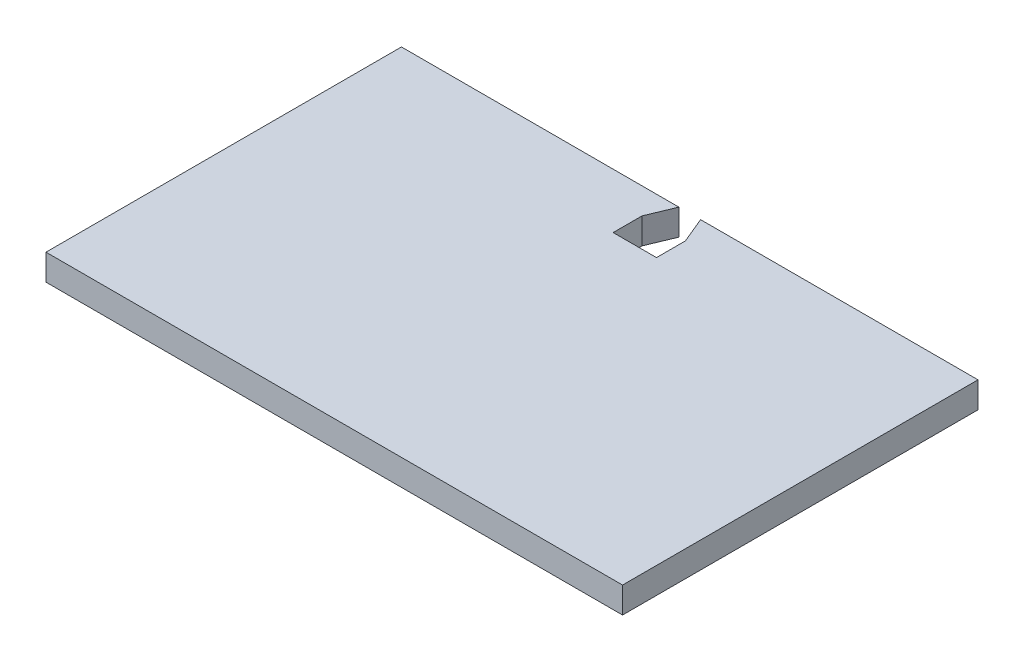
ISO-10303-21;
HEADER;
FILE_DESCRIPTION(('STEP AP214'),'2;1');
FILE_NAME('part.step','',(''),(''),'','','');
FILE_SCHEMA(('AUTOMOTIVE_DESIGN { 1 0 10303 214 1 1 1 1 }'));
ENDSEC;
DATA;
#1=APPLICATION_CONTEXT('core data for automotive mechanical design processes');
#2=APPLICATION_PROTOCOL_DEFINITION('international standard','automotive_design',2000,#1);
#3=PRODUCT_CONTEXT('',#1,'mechanical');
#4=PRODUCT('Part','Part','',(#3));
#5=PRODUCT_RELATED_PRODUCT_CATEGORY('part','',(#4));
#6=PRODUCT_DEFINITION_FORMATION('','',#4);
#7=PRODUCT_DEFINITION_CONTEXT('part definition',#1,'design');
#8=PRODUCT_DEFINITION('design','',#6,#7);
#9=PRODUCT_DEFINITION_SHAPE('','',#8);
#10=(LENGTH_UNIT() NAMED_UNIT(*) SI_UNIT(.MILLI.,.METRE.));
#11=(NAMED_UNIT(*) PLANE_ANGLE_UNIT() SI_UNIT($,.RADIAN.));
#12=(NAMED_UNIT(*) SI_UNIT($,.STERADIAN.) SOLID_ANGLE_UNIT());
#13=UNCERTAINTY_MEASURE_WITH_UNIT(LENGTH_MEASURE(1.E-05),#10,'distance_accuracy_value','');
#14=(GEOMETRIC_REPRESENTATION_CONTEXT(3) GLOBAL_UNCERTAINTY_ASSIGNED_CONTEXT((#13)) GLOBAL_UNIT_ASSIGNED_CONTEXT((#10,
#11,#12)) REPRESENTATION_CONTEXT('',''));
#15=CARTESIAN_POINT('',(0.,0.,0.));
#16=DIRECTION('',(0.,0.,1.));
#17=DIRECTION('',(1.,0.,0.));
#18=AXIS2_PLACEMENT_3D('',#15,#16,#17);
#19=CARTESIAN_POINT('',(-172.986223662885,18.,-68.0628038897893));
#20=DIRECTION('',(0.,0.,1.));
#21=DIRECTION('',(1.,0.,0.));
#22=AXIS2_PLACEMENT_3D('',#19,#20,#21);
#23=PLANE('',#22);
#24=DIRECTION('',(0.,1.,0.));
#25=VECTOR('',#24,1.);
#26=CARTESIAN_POINT('',(34.0137763371152,-0.001000000000001,-68.0628038897893));
#27=LINE('',#26,#25);
#28=CARTESIAN_POINT('',(34.0137763371152,0.,-68.0628038897893));
#29=VERTEX_POINT('',#28);
#30=CARTESIAN_POINT('',(34.0137763371152,18.,-68.0628038897893));
#31=VERTEX_POINT('',#30);
#32=EDGE_CURVE('E149',#29,#31,#27,.T.);
#33=ORIENTED_EDGE('',*,*,#32,.T.);
#34=DIRECTION('',(-1.,0.,0.));
#35=VECTOR('',#34,1.);
#36=CARTESIAN_POINT('',(-172.986223662885,18.,-68.0628038897893));
#37=LINE('',#36,#35);
#38=CARTESIAN_POINT('',(226.013776337115,18.,-68.0628038897893));
#39=VERTEX_POINT('',#38);
#40=EDGE_CURVE('E182',#39,#31,#37,.T.);
#41=ORIENTED_EDGE('',*,*,#40,.F.);
#42=DIRECTION('',(0.,-1.,0.));
#43=VECTOR('',#42,1.);
#44=CARTESIAN_POINT('',(226.013776337115,18.,-68.0628038897893));
#45=LINE('',#44,#43);
#46=CARTESIAN_POINT('',(226.013776337115,0.,-68.0628038897893));
#47=VERTEX_POINT('',#46);
#48=EDGE_CURVE('E181',#39,#47,#45,.T.);
#49=ORIENTED_EDGE('',*,*,#48,.T.);
#50=DIRECTION('',(-1.,0.,0.));
#51=VECTOR('',#50,1.);
#52=CARTESIAN_POINT('',(-172.986223662885,0.,-68.0628038897893));
#53=LINE('',#52,#51);
#54=EDGE_CURVE('E167',#47,#29,#53,.T.);
#55=ORIENTED_EDGE('',*,*,#54,.T.);
#56=EDGE_LOOP('',(#33,#41,#49,#55));
#57=FACE_BOUND('',#56,.T.);
#58=ADVANCED_FACE('F38',(#57),#23,.F.);
#59=CARTESIAN_POINT('',(0.,18.,0.));
#60=DIRECTION('',(0.,1.,0.));
#61=DIRECTION('',(0.,0.,1.));
#62=AXIS2_PLACEMENT_3D('',#59,#60,#61);
#63=PLANE('',#62);
#64=ORIENTED_EDGE('',*,*,#40,.T.);
#65=DIRECTION('',(0.384615384615385,0.,0.923076923076923));
#66=VECTOR('',#65,1.);
#67=CARTESIAN_POINT('',(53.146461691905,18.,-22.1443590382937));
#68=LINE('',#67,#66);
#69=CARTESIAN_POINT('',(41.5137763371152,18.,-50.0628038897893));
#70=VERTEX_POINT('',#69);
#71=EDGE_CURVE('E159',#31,#70,#68,.T.);
#72=ORIENTED_EDGE('',*,*,#71,.T.);
#73=DIRECTION('',(0.,0.,1.));
#74=VECTOR('',#73,1.);
#75=CARTESIAN_POINT('',(41.5137763371151,18.,0.));
#76=LINE('',#75,#74);
#77=CARTESIAN_POINT('',(41.5137763371151,18.,-30.0628038897893));
#78=VERTEX_POINT('',#77);
#79=EDGE_CURVE('E280',#70,#78,#76,.T.);
#80=ORIENTED_EDGE('',*,*,#79,.T.);
#81=DIRECTION('',(1.,0.,0.));
#82=VECTOR('',#81,1.);
#83=CARTESIAN_POINT('',(0.,18.,-30.0628038897893));
#84=LINE('',#83,#82);
#85=CARTESIAN_POINT('',(11.5137763371152,18.,-30.0628038897893));
#86=VERTEX_POINT('',#85);
#87=EDGE_CURVE('E284',#86,#78,#84,.T.);
#88=ORIENTED_EDGE('',*,*,#87,.F.);
#89=DIRECTION('',(0.,0.,1.));
#90=VECTOR('',#89,1.);
#91=CARTESIAN_POINT('',(11.5137763371152,18.,0.));
#92=LINE('',#91,#90);
#93=CARTESIAN_POINT('',(11.5137763371152,18.,-50.0628038897893));
#94=VERTEX_POINT('',#93);
#95=EDGE_CURVE('E288',#94,#86,#92,.T.);
#96=ORIENTED_EDGE('',*,*,#95,.F.);
#97=DIRECTION('',(-0.384615384615386,0.,0.923076923076923));
#98=VECTOR('',#97,1.);
#99=CARTESIAN_POINT('',(-7.96322154344843,18.,-3.31800897643686));
#100=LINE('',#99,#98);
#101=CARTESIAN_POINT('',(19.0137763371152,18.,-68.0628038897893));
#102=VERTEX_POINT('',#101);
#103=EDGE_CURVE('E292',#102,#94,#100,.T.);
#104=ORIENTED_EDGE('',*,*,#103,.F.);
#105=CARTESIAN_POINT('',(-172.986223662885,18.,-68.0628038897893));
#106=VERTEX_POINT('',#105);
#107=EDGE_CURVE('E157',#102,#106,#37,.T.);
#108=ORIENTED_EDGE('',*,*,#107,.T.);
#109=DIRECTION('',(0.,0.,1.));
#110=VECTOR('',#109,1.);
#111=CARTESIAN_POINT('',(-172.986223662885,18.,-68.0628038897893));
#112=LINE('',#111,#110);
#113=CARTESIAN_POINT('',(-172.986223662885,18.,177.937196110211));
#114=VERTEX_POINT('',#113);
#115=EDGE_CURVE('E173',#106,#114,#112,.T.);
#116=ORIENTED_EDGE('',*,*,#115,.T.);
#117=DIRECTION('',(1.,0.,0.));
#118=VECTOR('',#117,1.);
#119=CARTESIAN_POINT('',(-172.986223662885,18.,177.937196110211));
#120=LINE('',#119,#118);
#121=CARTESIAN_POINT('',(226.013776337115,18.,177.937196110211));
#122=VERTEX_POINT('',#121);
#123=EDGE_CURVE('E216',#114,#122,#120,.T.);
#124=ORIENTED_EDGE('',*,*,#123,.T.);
#125=DIRECTION('',(0.,0.,-1.));
#126=VECTOR('',#125,1.);
#127=CARTESIAN_POINT('',(226.013776337115,18.,-68.0628038897893));
#128=LINE('',#127,#126);
#129=EDGE_CURVE('E193',#122,#39,#128,.T.);
#130=ORIENTED_EDGE('',*,*,#129,.T.);
#131=EDGE_LOOP('',(#64,#72,#80,#88,#96,#104,#108,#116,#124,#130));
#132=FACE_BOUND('',#131,.T.);
#133=ADVANCED_FACE('F314',(#132),#63,.T.);
#134=CARTESIAN_POINT('',(0.,0.,0.));
#135=DIRECTION('',(0.,1.,0.));
#136=DIRECTION('',(0.,0.,1.));
#137=AXIS2_PLACEMENT_3D('',#134,#135,#136);
#138=PLANE('',#137);
#139=DIRECTION('',(0.,0.,-1.));
#140=VECTOR('',#139,1.);
#141=CARTESIAN_POINT('',(-92.9862236628848,0.,97.9371961102107));
#142=LINE('',#141,#140);
#143=CARTESIAN_POINT('',(-92.9862236628848,0.,97.9371961102107));
#144=VERTEX_POINT('',#143);
#145=CARTESIAN_POINT('',(-92.9862236628848,0.,11.9371961102107));
#146=VERTEX_POINT('',#145);
#147=EDGE_CURVE('E245',#144,#146,#142,.T.);
#148=ORIENTED_EDGE('',*,*,#147,.F.);
#149=DIRECTION('',(-1.,0.,0.));
#150=VECTOR('',#149,1.);
#151=CARTESIAN_POINT('',(146.013776337115,0.,97.9371961102107));
#152=LINE('',#151,#150);
#153=CARTESIAN_POINT('',(146.013776337115,0.,97.9371961102107));
#154=VERTEX_POINT('',#153);
#155=EDGE_CURVE('E62',#154,#144,#152,.T.);
#156=ORIENTED_EDGE('',*,*,#155,.F.);
#157=DIRECTION('',(0.,0.,1.));
#158=VECTOR('',#157,1.);
#159=CARTESIAN_POINT('',(146.013776337115,0.,11.9371961102107));
#160=LINE('',#159,#158);
#161=CARTESIAN_POINT('',(146.013776337115,0.,11.9371961102107));
#162=VERTEX_POINT('',#161);
#163=EDGE_CURVE('E236',#162,#154,#160,.T.);
#164=ORIENTED_EDGE('',*,*,#163,.F.);
#165=DIRECTION('',(1.,0.,0.));
#166=VECTOR('',#165,1.);
#167=CARTESIAN_POINT('',(-92.9862236628848,0.,11.9371961102107));
#168=LINE('',#167,#166);
#169=EDGE_CURVE('E241',#146,#162,#168,.T.);
#170=ORIENTED_EDGE('',*,*,#169,.F.);
#171=EDGE_LOOP('',(#148,#156,#164,#170));
#172=FACE_BOUND('',#171,.T.);
#173=DIRECTION('',(-0.384615384615384,0.,-0.923076923076923));
#174=VECTOR('',#173,1.);
#175=CARTESIAN_POINT('',(53.146461691905,0.,-22.1443590382937));
#176=LINE('',#175,#174);
#177=CARTESIAN_POINT('',(41.5137763371152,0.,-50.0628038897893));
#178=VERTEX_POINT('',#177);
#179=EDGE_CURVE('E198',#178,#29,#176,.T.);
#180=ORIENTED_EDGE('',*,*,#179,.T.);
#181=ORIENTED_EDGE('',*,*,#54,.F.);
#182=DIRECTION('',(0.,0.,-1.));
#183=VECTOR('',#182,1.);
#184=CARTESIAN_POINT('',(226.013776337115,0.,-68.0628038897893));
#185=LINE('',#184,#183);
#186=CARTESIAN_POINT('',(226.013776337115,0.,177.937196110211));
#187=VERTEX_POINT('',#186);
#188=EDGE_CURVE('E168',#187,#47,#185,.T.);
#189=ORIENTED_EDGE('',*,*,#188,.F.);
#190=DIRECTION('',(1.,0.,0.));
#191=VECTOR('',#190,1.);
#192=CARTESIAN_POINT('',(-172.986223662885,0.,177.937196110211));
#193=LINE('',#192,#191);
#194=CARTESIAN_POINT('',(-172.986223662885,0.,177.937196110211));
#195=VERTEX_POINT('',#194);
#196=EDGE_CURVE('E174',#195,#187,#193,.T.);
#197=ORIENTED_EDGE('',*,*,#196,.F.);
#198=DIRECTION('',(0.,0.,1.));
#199=VECTOR('',#198,1.);
#200=CARTESIAN_POINT('',(-172.986223662885,0.,-68.0628038897893));
#201=LINE('',#200,#199);
#202=CARTESIAN_POINT('',(-172.986223662885,0.,-68.0628038897893));
#203=VERTEX_POINT('',#202);
#204=EDGE_CURVE('E165',#203,#195,#201,.T.);
#205=ORIENTED_EDGE('',*,*,#204,.F.);
#206=CARTESIAN_POINT('',(19.0137763371152,0.,-68.0628038897893));
#207=VERTEX_POINT('',#206);
#208=EDGE_CURVE('E155',#207,#203,#53,.T.);
#209=ORIENTED_EDGE('',*,*,#208,.F.);
#210=DIRECTION('',(0.384615384615386,0.,-0.923076923076923));
#211=VECTOR('',#210,1.);
#212=CARTESIAN_POINT('',(-7.96322154344843,0.,-3.31800897643686));
#213=LINE('',#212,#211);
#214=CARTESIAN_POINT('',(11.5137763371152,0.,-50.0628038897893));
#215=VERTEX_POINT('',#214);
#216=EDGE_CURVE('E139',#215,#207,#213,.T.);
#217=ORIENTED_EDGE('',*,*,#216,.F.);
#218=DIRECTION('',(0.,0.,-1.));
#219=VECTOR('',#218,1.);
#220=CARTESIAN_POINT('',(11.5137763371152,0.,0.));
#221=LINE('',#220,#219);
#222=CARTESIAN_POINT('',(11.5137763371152,0.,-30.0628038897893));
#223=VERTEX_POINT('',#222);
#224=EDGE_CURVE('E54',#223,#215,#221,.T.);
#225=ORIENTED_EDGE('',*,*,#224,.F.);
#226=DIRECTION('',(-1.,0.,0.));
#227=VECTOR('',#226,1.);
#228=CARTESIAN_POINT('',(0.,0.,-30.0628038897893));
#229=LINE('',#228,#227);
#230=CARTESIAN_POINT('',(41.5137763371151,0.,-30.0628038897893));
#231=VERTEX_POINT('',#230);
#232=EDGE_CURVE('E300',#231,#223,#229,.T.);
#233=ORIENTED_EDGE('',*,*,#232,.F.);
#234=DIRECTION('',(0.,0.,-1.));
#235=VECTOR('',#234,1.);
#236=CARTESIAN_POINT('',(41.5137763371151,0.,0.));
#237=LINE('',#236,#235);
#238=EDGE_CURVE('E297',#231,#178,#237,.T.);
#239=ORIENTED_EDGE('',*,*,#238,.T.);
#240=EDGE_LOOP('',(#180,#181,#189,#197,#205,#209,#217,#225,#233,#239));
#241=FACE_BOUND('',#240,.T.);
#242=ADVANCED_FACE('F163',(#172,#241),#138,.F.);
#243=CARTESIAN_POINT('',(-172.986223662885,18.,-68.0628038897893));
#244=DIRECTION('',(1.,0.,0.));
#245=DIRECTION('',(0.,0.,-1.));
#246=AXIS2_PLACEMENT_3D('',#243,#244,#245);
#247=PLANE('',#246);
#248=ORIENTED_EDGE('',*,*,#204,.T.);
#249=DIRECTION('',(0.,-1.,0.));
#250=VECTOR('',#249,1.);
#251=CARTESIAN_POINT('',(-172.986223662885,18.,177.937196110211));
#252=LINE('',#251,#250);
#253=EDGE_CURVE('E11',#114,#195,#252,.T.);
#254=ORIENTED_EDGE('',*,*,#253,.F.);
#255=ORIENTED_EDGE('',*,*,#115,.F.);
#256=DIRECTION('',(0.,-1.,0.));
#257=VECTOR('',#256,1.);
#258=CARTESIAN_POINT('',(-172.986223662885,18.,-68.0628038897893));
#259=LINE('',#258,#257);
#260=EDGE_CURVE('E178',#106,#203,#259,.T.);
#261=ORIENTED_EDGE('',*,*,#260,.T.);
#262=EDGE_LOOP('',(#248,#254,#255,#261));
#263=FACE_BOUND('',#262,.T.);
#264=ADVANCED_FACE('F40',(#263),#247,.F.);
#265=CARTESIAN_POINT('',(-172.986223662885,18.,177.937196110211));
#266=DIRECTION('',(0.,0.,-1.));
#267=DIRECTION('',(-1.,0.,0.));
#268=AXIS2_PLACEMENT_3D('',#265,#266,#267);
#269=PLANE('',#268);
#270=ORIENTED_EDGE('',*,*,#196,.T.);
#271=DIRECTION('',(0.,-1.,0.));
#272=VECTOR('',#271,1.);
#273=CARTESIAN_POINT('',(226.013776337115,18.,177.937196110211));
#274=LINE('',#273,#272);
#275=EDGE_CURVE('E47',#122,#187,#274,.T.);
#276=ORIENTED_EDGE('',*,*,#275,.F.);
#277=ORIENTED_EDGE('',*,*,#123,.F.);
#278=ORIENTED_EDGE('',*,*,#253,.T.);
#279=EDGE_LOOP('',(#270,#276,#277,#278));
#280=FACE_BOUND('',#279,.T.);
#281=ADVANCED_FACE('F214',(#280),#269,.F.);
#282=CARTESIAN_POINT('',(226.013776337115,18.,-68.0628038897893));
#283=DIRECTION('',(-1.,0.,0.));
#284=DIRECTION('',(0.,0.,1.));
#285=AXIS2_PLACEMENT_3D('',#282,#283,#284);
#286=PLANE('',#285);
#287=ORIENTED_EDGE('',*,*,#188,.T.);
#288=ORIENTED_EDGE('',*,*,#48,.F.);
#289=ORIENTED_EDGE('',*,*,#129,.F.);
#290=ORIENTED_EDGE('',*,*,#275,.T.);
#291=EDGE_LOOP('',(#287,#288,#289,#290));
#292=FACE_BOUND('',#291,.T.);
#293=ADVANCED_FACE('F191',(#292),#286,.F.);
#294=ORIENTED_EDGE('',*,*,#107,.F.);
#295=DIRECTION('',(0.,1.,0.));
#296=VECTOR('',#295,1.);
#297=CARTESIAN_POINT('',(19.0137763371152,-0.001000000000001,-68.0628038897893));
#298=LINE('',#297,#296);
#299=EDGE_CURVE('E143',#207,#102,#298,.T.);
#300=ORIENTED_EDGE('',*,*,#299,.F.);
#301=ORIENTED_EDGE('',*,*,#208,.T.);
#302=ORIENTED_EDGE('',*,*,#260,.F.);
#303=EDGE_LOOP('',(#294,#300,#301,#302));
#304=FACE_BOUND('',#303,.T.);
#305=ADVANCED_FACE('F153',(#304),#23,.F.);
#306=CARTESIAN_POINT('',(146.013776337115,6.,97.9371961102107));
#307=DIRECTION('',(0.,0.,1.));
#308=DIRECTION('',(1.,0.,0.));
#309=AXIS2_PLACEMENT_3D('',#306,#307,#308);
#310=PLANE('',#309);
#311=ORIENTED_EDGE('',*,*,#155,.T.);
#312=DIRECTION('',(0.,-1.,0.));
#313=VECTOR('',#312,1.);
#314=CARTESIAN_POINT('',(-92.9862236628848,6.,97.9371961102107));
#315=LINE('',#314,#313);
#316=CARTESIAN_POINT('',(-92.9862236628848,6.,97.9371961102107));
#317=VERTEX_POINT('',#316);
#318=EDGE_CURVE('E224',#317,#144,#315,.T.);
#319=ORIENTED_EDGE('',*,*,#318,.F.);
#320=DIRECTION('',(-1.,0.,0.));
#321=VECTOR('',#320,1.);
#322=CARTESIAN_POINT('',(146.013776337115,6.,97.9371961102107));
#323=LINE('',#322,#321);
#324=CARTESIAN_POINT('',(146.013776337115,6.,97.9371961102107));
#325=VERTEX_POINT('',#324);
#326=EDGE_CURVE('E240',#325,#317,#323,.T.);
#327=ORIENTED_EDGE('',*,*,#326,.F.);
#328=DIRECTION('',(0.,-1.,0.));
#329=VECTOR('',#328,1.);
#330=CARTESIAN_POINT('',(146.013776337115,6.,97.9371961102107));
#331=LINE('',#330,#329);
#332=EDGE_CURVE('E212',#325,#154,#331,.T.);
#333=ORIENTED_EDGE('',*,*,#332,.T.);
#334=EDGE_LOOP('',(#311,#319,#327,#333));
#335=FACE_BOUND('',#334,.T.);
#336=ADVANCED_FACE('F336',(#335),#310,.F.);
#337=CARTESIAN_POINT('',(146.013776337115,6.,11.9371961102107));
#338=DIRECTION('',(1.,0.,0.));
#339=DIRECTION('',(0.,0.,-1.));
#340=AXIS2_PLACEMENT_3D('',#337,#338,#339);
#341=PLANE('',#340);
#342=ORIENTED_EDGE('',*,*,#163,.T.);
#343=ORIENTED_EDGE('',*,*,#332,.F.);
#344=DIRECTION('',(0.,0.,1.));
#345=VECTOR('',#344,1.);
#346=CARTESIAN_POINT('',(146.013776337115,6.,11.9371961102107));
#347=LINE('',#346,#345);
#348=CARTESIAN_POINT('',(146.013776337115,6.,11.9371961102107));
#349=VERTEX_POINT('',#348);
#350=EDGE_CURVE('E228',#349,#325,#347,.T.);
#351=ORIENTED_EDGE('',*,*,#350,.F.);
#352=DIRECTION('',(0.,-1.,0.));
#353=VECTOR('',#352,1.);
#354=CARTESIAN_POINT('',(146.013776337115,6.,11.9371961102107));
#355=LINE('',#354,#353);
#356=EDGE_CURVE('E231',#349,#162,#355,.T.);
#357=ORIENTED_EDGE('',*,*,#356,.T.);
#358=EDGE_LOOP('',(#342,#343,#351,#357));
#359=FACE_BOUND('',#358,.T.);
#360=ADVANCED_FACE('F342',(#359),#341,.F.);
#361=CARTESIAN_POINT('',(-92.9862236628848,6.,11.9371961102107));
#362=DIRECTION('',(0.,0.,-1.));
#363=DIRECTION('',(-1.,0.,0.));
#364=AXIS2_PLACEMENT_3D('',#361,#362,#363);
#365=PLANE('',#364);
#366=ORIENTED_EDGE('',*,*,#169,.T.);
#367=ORIENTED_EDGE('',*,*,#356,.F.);
#368=DIRECTION('',(1.,0.,0.));
#369=VECTOR('',#368,1.);
#370=CARTESIAN_POINT('',(-92.9862236628848,6.,11.9371961102107));
#371=LINE('',#370,#369);
#372=CARTESIAN_POINT('',(-92.9862236628848,6.,11.9371961102107));
#373=VERTEX_POINT('',#372);
#374=EDGE_CURVE('E254',#373,#349,#371,.T.);
#375=ORIENTED_EDGE('',*,*,#374,.F.);
#376=DIRECTION('',(0.,-1.,0.));
#377=VECTOR('',#376,1.);
#378=CARTESIAN_POINT('',(-92.9862236628848,6.,11.9371961102107));
#379=LINE('',#378,#377);
#380=EDGE_CURVE('E227',#373,#146,#379,.T.);
#381=ORIENTED_EDGE('',*,*,#380,.T.);
#382=EDGE_LOOP('',(#366,#367,#375,#381));
#383=FACE_BOUND('',#382,.T.);
#384=ADVANCED_FACE('F362',(#383),#365,.F.);
#385=CARTESIAN_POINT('',(-92.9862236628848,6.,97.9371961102107));
#386=DIRECTION('',(-1.,0.,0.));
#387=DIRECTION('',(0.,0.,1.));
#388=AXIS2_PLACEMENT_3D('',#385,#386,#387);
#389=PLANE('',#388);
#390=ORIENTED_EDGE('',*,*,#147,.T.);
#391=ORIENTED_EDGE('',*,*,#380,.F.);
#392=DIRECTION('',(0.,0.,-1.));
#393=VECTOR('',#392,1.);
#394=CARTESIAN_POINT('',(-92.9862236628848,6.,97.9371961102107));
#395=LINE('',#394,#393);
#396=EDGE_CURVE('E258',#317,#373,#395,.T.);
#397=ORIENTED_EDGE('',*,*,#396,.F.);
#398=ORIENTED_EDGE('',*,*,#318,.T.);
#399=EDGE_LOOP('',(#390,#391,#397,#398));
#400=FACE_BOUND('',#399,.T.);
#401=ADVANCED_FACE('F358',(#400),#389,.F.);
#402=CARTESIAN_POINT('',(0.,6.,0.));
#403=DIRECTION('',(0.,-1.,0.));
#404=DIRECTION('',(0.,0.,-1.));
#405=AXIS2_PLACEMENT_3D('',#402,#403,#404);
#406=PLANE('',#405);
#407=ORIENTED_EDGE('',*,*,#326,.T.);
#408=ORIENTED_EDGE('',*,*,#396,.T.);
#409=ORIENTED_EDGE('',*,*,#374,.T.);
#410=ORIENTED_EDGE('',*,*,#350,.T.);
#411=EDGE_LOOP('',(#407,#408,#409,#410));
#412=FACE_BOUND('',#411,.T.);
#413=ADVANCED_FACE('F361',(#412),#406,.T.);
#414=CARTESIAN_POINT('',(53.146461691905,-0.001000000000001,-22.1443590382937));
#415=DIRECTION('',(-0.923076923076923,0.,0.384615384615384));
#416=DIRECTION('',(0.384615384615384,0.,0.923076923076923));
#417=AXIS2_PLACEMENT_3D('',#414,#415,#416);
#418=PLANE('',#417);
#419=DIRECTION('',(0.,1.,0.));
#420=VECTOR('',#419,1.);
#421=CARTESIAN_POINT('',(41.5137763371152,-0.001000000000001,-50.0628038897893));
#422=LINE('',#421,#420);
#423=EDGE_CURVE('E273',#178,#70,#422,.T.);
#424=ORIENTED_EDGE('',*,*,#423,.T.);
#425=ORIENTED_EDGE('',*,*,#71,.F.);
#426=ORIENTED_EDGE('',*,*,#32,.F.);
#427=ORIENTED_EDGE('',*,*,#179,.F.);
#428=EDGE_LOOP('',(#424,#425,#426,#427));
#429=FACE_BOUND('',#428,.T.);
#430=ADVANCED_FACE('F313',(#429),#418,.T.);
#431=CARTESIAN_POINT('',(41.5137763371151,-0.001000000000001,0.));
#432=DIRECTION('',(-1.,0.,0.));
#433=DIRECTION('',(0.,0.,1.));
#434=AXIS2_PLACEMENT_3D('',#431,#432,#433);
#435=PLANE('',#434);
#436=DIRECTION('',(0.,1.,0.));
#437=VECTOR('',#436,1.);
#438=CARTESIAN_POINT('',(41.5137763371151,-0.001000000000001,-30.0628038897893));
#439=LINE('',#438,#437);
#440=EDGE_CURVE('E270',#231,#78,#439,.T.);
#441=ORIENTED_EDGE('',*,*,#440,.T.);
#442=ORIENTED_EDGE('',*,*,#79,.F.);
#443=ORIENTED_EDGE('',*,*,#423,.F.);
#444=ORIENTED_EDGE('',*,*,#238,.F.);
#445=EDGE_LOOP('',(#441,#442,#443,#444));
#446=FACE_BOUND('',#445,.T.);
#447=ADVANCED_FACE('F310',(#446),#435,.T.);
#448=CARTESIAN_POINT('',(0.,-0.001000000000001,-30.0628038897893));
#449=DIRECTION('',(0.,0.,1.));
#450=DIRECTION('',(1.,0.,0.));
#451=AXIS2_PLACEMENT_3D('',#448,#449,#450);
#452=PLANE('',#451);
#453=ORIENTED_EDGE('',*,*,#232,.T.);
#454=DIRECTION('',(0.,1.,0.));
#455=VECTOR('',#454,1.);
#456=CARTESIAN_POINT('',(11.5137763371152,-0.001000000000001,-30.0628038897893));
#457=LINE('',#456,#455);
#458=EDGE_CURVE('E267',#223,#86,#457,.T.);
#459=ORIENTED_EDGE('',*,*,#458,.T.);
#460=ORIENTED_EDGE('',*,*,#87,.T.);
#461=ORIENTED_EDGE('',*,*,#440,.F.);
#462=EDGE_LOOP('',(#453,#459,#460,#461));
#463=FACE_BOUND('',#462,.T.);
#464=ADVANCED_FACE('F307',(#463),#452,.F.);
#465=CARTESIAN_POINT('',(11.5137763371152,-0.001000000000001,0.));
#466=DIRECTION('',(-1.,0.,0.));
#467=DIRECTION('',(0.,0.,1.));
#468=AXIS2_PLACEMENT_3D('',#465,#466,#467);
#469=PLANE('',#468);
#470=ORIENTED_EDGE('',*,*,#224,.T.);
#471=DIRECTION('',(0.,1.,0.));
#472=VECTOR('',#471,1.);
#473=CARTESIAN_POINT('',(11.5137763371152,-0.001000000000001,-50.0628038897893));
#474=LINE('',#473,#472);
#475=EDGE_CURVE('E145',#215,#94,#474,.T.);
#476=ORIENTED_EDGE('',*,*,#475,.T.);
#477=ORIENTED_EDGE('',*,*,#95,.T.);
#478=ORIENTED_EDGE('',*,*,#458,.F.);
#479=EDGE_LOOP('',(#470,#476,#477,#478));
#480=FACE_BOUND('',#479,.T.);
#481=ADVANCED_FACE('F317',(#480),#469,.F.);
#482=CARTESIAN_POINT('',(-7.96322154344843,-0.001000000000001,-3.31800897643686));
#483=DIRECTION('',(-0.923076923076923,0.,-0.384615384615386));
#484=DIRECTION('',(-0.384615384615386,0.,0.923076923076923));
#485=AXIS2_PLACEMENT_3D('',#482,#483,#484);
#486=PLANE('',#485);
#487=ORIENTED_EDGE('',*,*,#216,.T.);
#488=ORIENTED_EDGE('',*,*,#299,.T.);
#489=ORIENTED_EDGE('',*,*,#103,.T.);
#490=ORIENTED_EDGE('',*,*,#475,.F.);
#491=EDGE_LOOP('',(#487,#488,#489,#490));
#492=FACE_BOUND('',#491,.T.);
#493=ADVANCED_FACE('F141',(#492),#486,.F.);
#494=CLOSED_SHELL('',(#58,#133,#242,#264,#281,#293,#305,#336,#360,#384,#401,#413,#430,#447,#464,
#481,#493));
#495=MANIFOLD_SOLID_BREP('B2',#494);
#496=ADVANCED_BREP_SHAPE_REPRESENTATION('',(#18,#495),#14);
#497=SHAPE_DEFINITION_REPRESENTATION(#9,#496);
ENDSEC;
END-ISO-10303-21;
